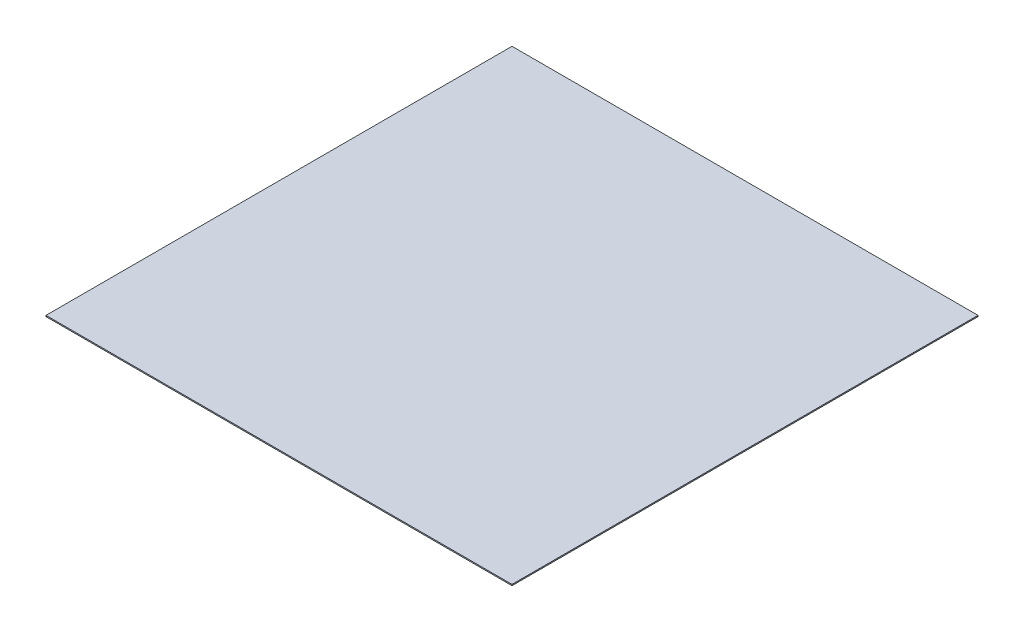
ISO-10303-21;
HEADER;
FILE_DESCRIPTION(('STEP AP214'),'2;1');
FILE_NAME('part.step','',(''),(''),'','','');
FILE_SCHEMA(('AUTOMOTIVE_DESIGN { 1 0 10303 214 1 1 1 1 }'));
ENDSEC;
DATA;
#1=APPLICATION_CONTEXT('core data for automotive mechanical design processes');
#2=APPLICATION_PROTOCOL_DEFINITION('international standard','automotive_design',2000,#1);
#3=PRODUCT_CONTEXT('',#1,'mechanical');
#4=PRODUCT('Part','Part','',(#3));
#5=PRODUCT_RELATED_PRODUCT_CATEGORY('part','',(#4));
#6=PRODUCT_DEFINITION_FORMATION('','',#4);
#7=PRODUCT_DEFINITION_CONTEXT('part definition',#1,'design');
#8=PRODUCT_DEFINITION('design','',#6,#7);
#9=PRODUCT_DEFINITION_SHAPE('','',#8);
#10=(LENGTH_UNIT() NAMED_UNIT(*) SI_UNIT(.MILLI.,.METRE.));
#11=(NAMED_UNIT(*) PLANE_ANGLE_UNIT() SI_UNIT($,.RADIAN.));
#12=(NAMED_UNIT(*) SI_UNIT($,.STERADIAN.) SOLID_ANGLE_UNIT());
#13=UNCERTAINTY_MEASURE_WITH_UNIT(LENGTH_MEASURE(1.E-05),#10,'distance_accuracy_value','');
#14=(GEOMETRIC_REPRESENTATION_CONTEXT(3) GLOBAL_UNCERTAINTY_ASSIGNED_CONTEXT((#13)) GLOBAL_UNIT_ASSIGNED_CONTEXT((#10,
#11,#12)) REPRESENTATION_CONTEXT('',''));
#15=CARTESIAN_POINT('',(0.,0.,0.));
#16=DIRECTION('',(0.,0.,1.));
#17=DIRECTION('',(1.,0.,0.));
#18=AXIS2_PLACEMENT_3D('',#15,#16,#17);
#19=CARTESIAN_POINT('',(635.,3.175,-635.));
#20=DIRECTION('',(-1.,0.,0.));
#21=DIRECTION('',(0.,0.,1.));
#22=AXIS2_PLACEMENT_3D('',#19,#20,#21);
#23=PLANE('',#22);
#24=DIRECTION('',(0.,0.,-1.));
#25=VECTOR('',#24,1.);
#26=CARTESIAN_POINT('',(635.,0.,-635.));
#27=LINE('',#26,#25);
#28=CARTESIAN_POINT('',(635.,0.,635.));
#29=VERTEX_POINT('',#28);
#30=CARTESIAN_POINT('',(635.,0.,-635.));
#31=VERTEX_POINT('',#30);
#32=EDGE_CURVE('E100',#29,#31,#27,.T.);
#33=ORIENTED_EDGE('',*,*,#32,.T.);
#34=DIRECTION('',(0.,-1.,0.));
#35=VECTOR('',#34,1.);
#36=CARTESIAN_POINT('',(635.,3.175,-635.));
#37=LINE('',#36,#35);
#38=CARTESIAN_POINT('',(635.,3.175,-635.));
#39=VERTEX_POINT('',#38);
#40=EDGE_CURVE('E11',#39,#31,#37,.T.);
#41=ORIENTED_EDGE('',*,*,#40,.F.);
#42=DIRECTION('',(0.,0.,-1.));
#43=VECTOR('',#42,1.);
#44=CARTESIAN_POINT('',(635.,3.175,-635.));
#45=LINE('',#44,#43);
#46=CARTESIAN_POINT('',(635.,3.175,635.));
#47=VERTEX_POINT('',#46);
#48=EDGE_CURVE('E88',#47,#39,#45,.T.);
#49=ORIENTED_EDGE('',*,*,#48,.F.);
#50=DIRECTION('',(0.,-1.,0.));
#51=VECTOR('',#50,1.);
#52=CARTESIAN_POINT('',(635.,3.175,635.));
#53=LINE('',#52,#51);
#54=EDGE_CURVE('E96',#47,#29,#53,.T.);
#55=ORIENTED_EDGE('',*,*,#54,.T.);
#56=EDGE_LOOP('',(#33,#41,#49,#55));
#57=FACE_BOUND('',#56,.T.);
#58=ADVANCED_FACE('F37',(#57),#23,.F.);
#59=CARTESIAN_POINT('',(-635.,3.175,-635.));
#60=DIRECTION('',(0.,0.,1.));
#61=DIRECTION('',(1.,0.,0.));
#62=AXIS2_PLACEMENT_3D('',#59,#60,#61);
#63=PLANE('',#62);
#64=DIRECTION('',(-1.,0.,0.));
#65=VECTOR('',#64,1.);
#66=CARTESIAN_POINT('',(-635.,0.,-635.));
#67=LINE('',#66,#65);
#68=CARTESIAN_POINT('',(-635.,0.,-635.));
#69=VERTEX_POINT('',#68);
#70=EDGE_CURVE('E92',#31,#69,#67,.T.);
#71=ORIENTED_EDGE('',*,*,#70,.T.);
#72=DIRECTION('',(0.,-1.,0.));
#73=VECTOR('',#72,1.);
#74=CARTESIAN_POINT('',(-635.,3.175,-635.));
#75=LINE('',#74,#73);
#76=CARTESIAN_POINT('',(-635.,3.175,-635.));
#77=VERTEX_POINT('',#76);
#78=EDGE_CURVE('E45',#77,#69,#75,.T.);
#79=ORIENTED_EDGE('',*,*,#78,.F.);
#80=DIRECTION('',(-1.,0.,0.));
#81=VECTOR('',#80,1.);
#82=CARTESIAN_POINT('',(-635.,3.175,-635.));
#83=LINE('',#82,#81);
#84=EDGE_CURVE('E83',#39,#77,#83,.T.);
#85=ORIENTED_EDGE('',*,*,#84,.F.);
#86=ORIENTED_EDGE('',*,*,#40,.T.);
#87=EDGE_LOOP('',(#71,#79,#85,#86));
#88=FACE_BOUND('',#87,.T.);
#89=ADVANCED_FACE('F91',(#88),#63,.F.);
#90=CARTESIAN_POINT('',(-635.,3.175,-635.));
#91=DIRECTION('',(1.,0.,0.));
#92=DIRECTION('',(0.,0.,-1.));
#93=AXIS2_PLACEMENT_3D('',#90,#91,#92);
#94=PLANE('',#93);
#95=DIRECTION('',(0.,0.,1.));
#96=VECTOR('',#95,1.);
#97=CARTESIAN_POINT('',(-635.,0.,-635.));
#98=LINE('',#97,#96);
#99=CARTESIAN_POINT('',(-635.,0.,635.));
#100=VERTEX_POINT('',#99);
#101=EDGE_CURVE('E70',#69,#100,#98,.T.);
#102=ORIENTED_EDGE('',*,*,#101,.T.);
#103=DIRECTION('',(0.,-1.,0.));
#104=VECTOR('',#103,1.);
#105=CARTESIAN_POINT('',(-635.,3.175,635.));
#106=LINE('',#105,#104);
#107=CARTESIAN_POINT('',(-635.,3.175,635.));
#108=VERTEX_POINT('',#107);
#109=EDGE_CURVE('E93',#108,#100,#106,.T.);
#110=ORIENTED_EDGE('',*,*,#109,.F.);
#111=DIRECTION('',(0.,0.,1.));
#112=VECTOR('',#111,1.);
#113=CARTESIAN_POINT('',(-635.,3.175,-635.));
#114=LINE('',#113,#112);
#115=EDGE_CURVE('E86',#77,#108,#114,.T.);
#116=ORIENTED_EDGE('',*,*,#115,.F.);
#117=ORIENTED_EDGE('',*,*,#78,.T.);
#118=EDGE_LOOP('',(#102,#110,#116,#117));
#119=FACE_BOUND('',#118,.T.);
#120=ADVANCED_FACE('F94',(#119),#94,.F.);
#121=CARTESIAN_POINT('',(-635.,3.175,635.));
#122=DIRECTION('',(0.,0.,-1.));
#123=DIRECTION('',(-1.,0.,0.));
#124=AXIS2_PLACEMENT_3D('',#121,#122,#123);
#125=PLANE('',#124);
#126=DIRECTION('',(1.,0.,0.));
#127=VECTOR('',#126,1.);
#128=CARTESIAN_POINT('',(-635.,0.,635.));
#129=LINE('',#128,#127);
#130=EDGE_CURVE('E76',#100,#29,#129,.T.);
#131=ORIENTED_EDGE('',*,*,#130,.T.);
#132=ORIENTED_EDGE('',*,*,#54,.F.);
#133=DIRECTION('',(1.,0.,0.));
#134=VECTOR('',#133,1.);
#135=CARTESIAN_POINT('',(-635.,3.175,635.));
#136=LINE('',#135,#134);
#137=EDGE_CURVE('E53',#108,#47,#136,.T.);
#138=ORIENTED_EDGE('',*,*,#137,.F.);
#139=ORIENTED_EDGE('',*,*,#109,.T.);
#140=EDGE_LOOP('',(#131,#132,#138,#139));
#141=FACE_BOUND('',#140,.T.);
#142=ADVANCED_FACE('F107',(#141),#125,.F.);
#143=CARTESIAN_POINT('',(0.,3.175,0.));
#144=DIRECTION('',(0.,1.,0.));
#145=DIRECTION('',(0.,0.,1.));
#146=AXIS2_PLACEMENT_3D('',#143,#144,#145);
#147=PLANE('',#146);
#148=ORIENTED_EDGE('',*,*,#48,.T.);
#149=ORIENTED_EDGE('',*,*,#84,.T.);
#150=ORIENTED_EDGE('',*,*,#115,.T.);
#151=ORIENTED_EDGE('',*,*,#137,.T.);
#152=EDGE_LOOP('',(#148,#149,#150,#151));
#153=FACE_BOUND('',#152,.T.);
#154=ADVANCED_FACE('F84',(#153),#147,.T.);
#155=CARTESIAN_POINT('',(0.,0.,0.));
#156=DIRECTION('',(0.,1.,0.));
#157=DIRECTION('',(0.,0.,1.));
#158=AXIS2_PLACEMENT_3D('',#155,#156,#157);
#159=PLANE('',#158);
#160=ORIENTED_EDGE('',*,*,#32,.F.);
#161=ORIENTED_EDGE('',*,*,#130,.F.);
#162=ORIENTED_EDGE('',*,*,#101,.F.);
#163=ORIENTED_EDGE('',*,*,#70,.F.);
#164=EDGE_LOOP('',(#160,#161,#162,#163));
#165=FACE_BOUND('',#164,.T.);
#166=ADVANCED_FACE('F110',(#165),#159,.F.);
#167=CLOSED_SHELL('',(#58,#89,#120,#142,#154,#166));
#168=MANIFOLD_SOLID_BREP('B2',#167);
#169=ADVANCED_BREP_SHAPE_REPRESENTATION('',(#18,#168),#14);
#170=SHAPE_DEFINITION_REPRESENTATION(#9,#169);
ENDSEC;
END-ISO-10303-21;
